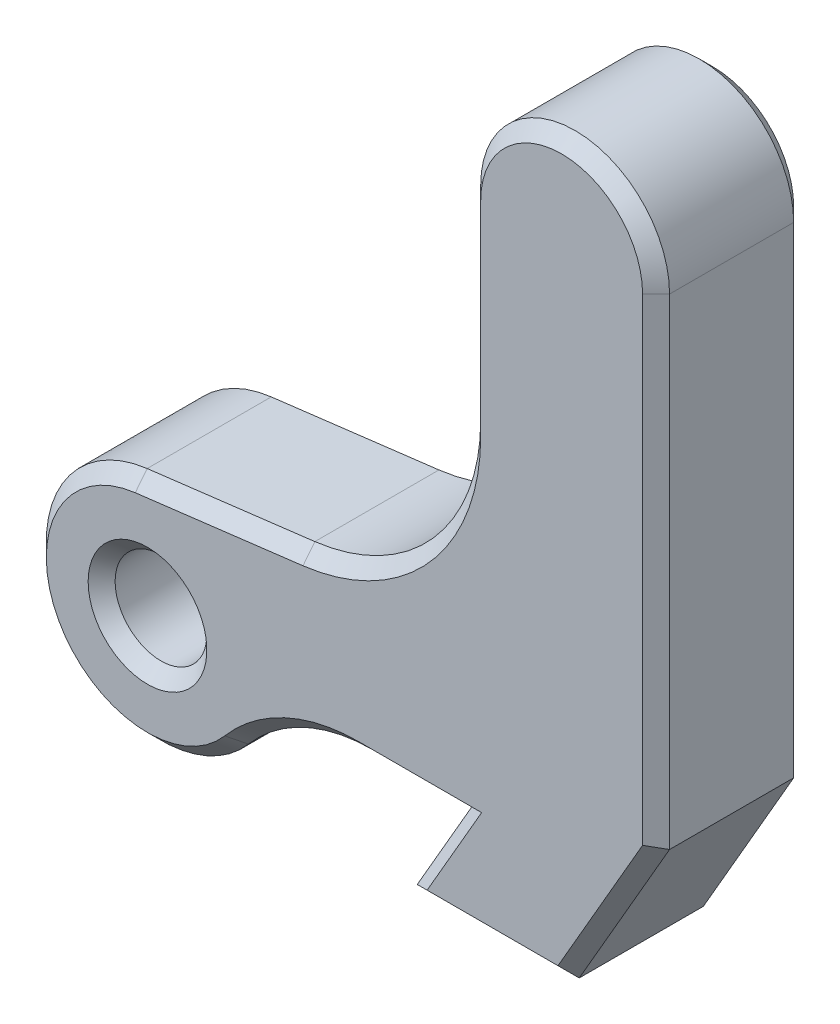
ISO-10303-21;
HEADER;
FILE_DESCRIPTION(('STEP AP214'),'2;1');
FILE_NAME('part.step','',(''),(''),'','','');
FILE_SCHEMA(('AUTOMOTIVE_DESIGN { 1 0 10303 214 1 1 1 1 }'));
ENDSEC;
DATA;
#1=APPLICATION_CONTEXT('core data for automotive mechanical design processes');
#2=APPLICATION_PROTOCOL_DEFINITION('international standard','automotive_design',2000,#1);
#3=PRODUCT_CONTEXT('',#1,'mechanical');
#4=PRODUCT('Part','Part','',(#3));
#5=PRODUCT_RELATED_PRODUCT_CATEGORY('part','',(#4));
#6=PRODUCT_DEFINITION_FORMATION('','',#4);
#7=PRODUCT_DEFINITION_CONTEXT('part definition',#1,'design');
#8=PRODUCT_DEFINITION('design','',#6,#7);
#9=PRODUCT_DEFINITION_SHAPE('','',#8);
#10=(LENGTH_UNIT() NAMED_UNIT(*) SI_UNIT(.MILLI.,.METRE.));
#11=(NAMED_UNIT(*) PLANE_ANGLE_UNIT() SI_UNIT($,.RADIAN.));
#12=(NAMED_UNIT(*) SI_UNIT($,.STERADIAN.) SOLID_ANGLE_UNIT());
#13=UNCERTAINTY_MEASURE_WITH_UNIT(LENGTH_MEASURE(1.E-05),#10,'distance_accuracy_value','');
#14=(GEOMETRIC_REPRESENTATION_CONTEXT(3) GLOBAL_UNCERTAINTY_ASSIGNED_CONTEXT((#13)) GLOBAL_UNIT_ASSIGNED_CONTEXT((#10,
#11,#12)) REPRESENTATION_CONTEXT('',''));
#15=CARTESIAN_POINT('',(0.,0.,0.));
#16=DIRECTION('',(0.,0.,1.));
#17=DIRECTION('',(1.,0.,0.));
#18=AXIS2_PLACEMENT_3D('',#15,#16,#17);
#19=CARTESIAN_POINT('',(19.5977967476419,23.7480755988893,5.6));
#20=DIRECTION('',(0.,0.,-1.));
#21=DIRECTION('',(-1.,0.,0.));
#22=AXIS2_PLACEMENT_3D('',#19,#20,#21);
#23=PLANE('',#22);
#24=CARTESIAN_POINT('',(4.24779677552308,4.24740051239632,5.6));
#25=DIRECTION('',(0.,0.,-1.));
#26=DIRECTION('',(-1.,0.,0.));
#27=AXIS2_PLACEMENT_3D('',#24,#25,#26);
#28=CIRCLE('',#27,2.19999999999999);
#29=CARTESIAN_POINT('',(2.04779677552308,4.24740051239632,5.6));
#30=VERTEX_POINT('',#29);
#31=EDGE_CURVE('E11',#30,#30,#28,.T.);
#32=ORIENTED_EDGE('',*,*,#31,.T.);
#33=EDGE_LOOP('',(#32));
#34=FACE_BOUND('',#33,.T.);
#35=DIRECTION('',(0.500000000000001,0.866025403784438,0.));
#36=VECTOR('',#35,1.);
#37=CARTESIAN_POINT('',(29.5097465579445,18.025408707717,5.6));
#38=LINE('',#37,#36);
#39=CARTESIAN_POINT('',(19.4616011301781,0.621510304984686,5.6));
#40=VERTEX_POINT('',#39);
#41=CARTESIAN_POINT('',(22.5977967755231,6.05356050519845,5.6));
#42=VERTEX_POINT('',#41);
#43=EDGE_CURVE('E50',#40,#42,#38,.T.);
#44=ORIENTED_EDGE('',*,*,#43,.T.);
#45=DIRECTION('',(0.,1.,0.));
#46=VECTOR('',#45,1.);
#47=CARTESIAN_POINT('',(22.5977967755231,23.7480755988893,5.6));
#48=LINE('',#47,#46);
#49=CARTESIAN_POINT('',(22.5977967755231,23.7480755988893,5.6));
#50=VERTEX_POINT('',#49);
#51=EDGE_CURVE('E42',#42,#50,#48,.T.);
#52=ORIENTED_EDGE('',*,*,#51,.T.);
#53=CARTESIAN_POINT('',(19.5977967476419,23.7480755988893,5.6));
#54=DIRECTION('',(0.,0.,-1.));
#55=DIRECTION('',(-1.,0.,0.));
#56=AXIS2_PLACEMENT_3D('',#53,#54,#55);
#57=CIRCLE('',#56,3.00000002788114);
#58=CARTESIAN_POINT('',(16.5977967197608,23.7480755988893,5.6));
#59=VERTEX_POINT('',#58);
#60=EDGE_CURVE('E269',#50,#59,#57,.F.);
#61=ORIENTED_EDGE('',*,*,#60,.T.);
#62=DIRECTION('',(0.,-1.,0.));
#63=VECTOR('',#62,1.);
#64=CARTESIAN_POINT('',(16.5977967197608,23.7480755988893,5.6));
#65=LINE('',#64,#63);
#66=CARTESIAN_POINT('',(16.5977967197608,16.1773871829658,5.6));
#67=VERTEX_POINT('',#66);
#68=EDGE_CURVE('E271',#59,#67,#65,.T.);
#69=ORIENTED_EDGE('',*,*,#68,.T.);
#70=CARTESIAN_POINT('',(9.0977967197608,16.1773871829658,5.6));
#71=DIRECTION('',(0.,0.,-1.));
#72=DIRECTION('',(-1.,0.,0.));
#73=AXIS2_PLACEMENT_3D('',#70,#71,#72);
#74=CIRCLE('',#73,7.5);
#75=CARTESIAN_POINT('',(10.0118164490113,8.73329100313708,5.6));
#76=VERTEX_POINT('',#75);
#77=EDGE_CURVE('E273',#67,#76,#74,.T.);
#78=ORIENTED_EDGE('',*,*,#77,.T.);
#79=DIRECTION('',(-0.992546157310499,-0.121869297233397,0.));
#80=VECTOR('',#79,1.);
#81=CARTESIAN_POINT('',(21.2716264621641,10.1158212997661,5.6));
#82=LINE('',#81,#80);
#83=CARTESIAN_POINT('',(3.79567087701856,7.97004459209662,5.6));
#84=VERTEX_POINT('',#83);
#85=EDGE_CURVE('E275',#76,#84,#82,.T.);
#86=ORIENTED_EDGE('',*,*,#85,.T.);
#87=CARTESIAN_POINT('',(4.24779677552308,4.24740051239632,5.6));
#88=DIRECTION('',(0.,0.,-1.));
#89=DIRECTION('',(-1.,0.,0.));
#90=AXIS2_PLACEMENT_3D('',#87,#88,#89);
#91=CIRCLE('',#90,3.75);
#92=CARTESIAN_POINT('',(7.10895200722131,1.82329433895304,5.6));
#93=VERTEX_POINT('',#92);
#94=EDGE_CURVE('E277',#84,#93,#91,.F.);
#95=ORIENTED_EDGE('',*,*,#94,.T.);
#96=CARTESIAN_POINT('',(12.0682877421649,-2.37848969501531,5.6));
#97=DIRECTION('',(0.,0.,-1.));
#98=DIRECTION('',(-1.,0.,0.));
#99=AXIS2_PLACEMENT_3D('',#96,#97,#98);
#100=CIRCLE('',#99,6.5);
#101=CARTESIAN_POINT('',(12.0682877421649,4.12151030498469,5.6));
#102=VERTEX_POINT('',#101);
#103=EDGE_CURVE('E279',#93,#102,#100,.T.);
#104=ORIENTED_EDGE('',*,*,#103,.T.);
#105=DIRECTION('',(1.,0.,0.));
#106=VECTOR('',#105,1.);
#107=CARTESIAN_POINT('',(19.5977967476419,4.12151030498469,5.6));
#108=LINE('',#107,#106);
#109=CARTESIAN_POINT('',(16.6325848111489,4.12151030498469,5.6));
#110=VERTEX_POINT('',#109);
#111=EDGE_CURVE('E281',#102,#110,#108,.T.);
#112=ORIENTED_EDGE('',*,*,#111,.T.);
#113=DIRECTION('',(-0.500000000000001,-0.866025403784438,0.));
#114=VECTOR('',#113,1.);
#115=CARTESIAN_POINT('',(25.8724398620499,20.125408707717,5.6));
#116=LINE('',#115,#114);
#117=CARTESIAN_POINT('',(14.6118588689852,0.621510304984685,5.6));
#118=VERTEX_POINT('',#117);
#119=EDGE_CURVE('E283',#110,#118,#116,.T.);
#120=ORIENTED_EDGE('',*,*,#119,.T.);
#121=DIRECTION('',(1.,0.,0.));
#122=VECTOR('',#121,1.);
#123=CARTESIAN_POINT('',(19.5977967476419,0.621510304984686,5.6));
#124=LINE('',#123,#122);
#125=EDGE_CURVE('E55',#118,#40,#124,.T.);
#126=ORIENTED_EDGE('',*,*,#125,.T.);
#127=EDGE_LOOP('',(#44,#52,#61,#69,#78,#86,#95,#104,#112,#120,#126));
#128=FACE_BOUND('',#127,.T.);
#129=ADVANCED_FACE('F33',(#34,#128),#23,.F.);
#130=CARTESIAN_POINT('',(19.5977967476419,23.7480755988893,0.));
#131=DIRECTION('',(0.,0.,-1.));
#132=DIRECTION('',(-1.,0.,0.));
#133=AXIS2_PLACEMENT_3D('',#130,#131,#132);
#134=PLANE('',#133);
#135=CARTESIAN_POINT('',(4.24779677552308,4.24740051239632,0.));
#136=DIRECTION('',(0.,0.,-1.));
#137=DIRECTION('',(-1.,0.,0.));
#138=AXIS2_PLACEMENT_3D('',#135,#136,#137);
#139=CIRCLE('',#138,2.2);
#140=CARTESIAN_POINT('',(2.04779677552308,4.24740051239632,0.));
#141=VERTEX_POINT('',#140);
#142=EDGE_CURVE('E211',#141,#141,#139,.F.);
#143=ORIENTED_EDGE('',*,*,#142,.T.);
#144=EDGE_LOOP('',(#143));
#145=FACE_BOUND('',#144,.T.);
#146=CARTESIAN_POINT('',(9.0977967197608,16.1773871829658,0.));
#147=DIRECTION('',(0.,0.,-1.));
#148=DIRECTION('',(-1.,0.,0.));
#149=AXIS2_PLACEMENT_3D('',#146,#147,#148);
#150=CIRCLE('',#149,7.5);
#151=CARTESIAN_POINT('',(10.0118164490113,8.73329100313708,0.));
#152=VERTEX_POINT('',#151);
#153=CARTESIAN_POINT('',(16.5977967197608,16.1773871829658,0.));
#154=VERTEX_POINT('',#153);
#155=EDGE_CURVE('E210',#152,#154,#150,.F.);
#156=ORIENTED_EDGE('',*,*,#155,.T.);
#157=DIRECTION('',(0.,1.,0.));
#158=VECTOR('',#157,1.);
#159=CARTESIAN_POINT('',(16.5977967197608,23.7480755988893,0.));
#160=LINE('',#159,#158);
#161=CARTESIAN_POINT('',(16.5977967197608,23.7480755988893,0.));
#162=VERTEX_POINT('',#161);
#163=EDGE_CURVE('E189',#154,#162,#160,.T.);
#164=ORIENTED_EDGE('',*,*,#163,.T.);
#165=CARTESIAN_POINT('',(19.5977967476419,23.7480755988893,0.));
#166=DIRECTION('',(0.,0.,-1.));
#167=DIRECTION('',(-1.,0.,0.));
#168=AXIS2_PLACEMENT_3D('',#165,#166,#167);
#169=CIRCLE('',#168,3.00000002788114);
#170=CARTESIAN_POINT('',(22.5977967755231,23.7480755988893,0.));
#171=VERTEX_POINT('',#170);
#172=EDGE_CURVE('E199',#162,#171,#169,.T.);
#173=ORIENTED_EDGE('',*,*,#172,.T.);
#174=DIRECTION('',(0.,-1.,0.));
#175=VECTOR('',#174,1.);
#176=CARTESIAN_POINT('',(22.5977967755231,5.91958590898287,0.));
#177=LINE('',#176,#175);
#178=CARTESIAN_POINT('',(22.5977967755231,6.05356050519843,0.));
#179=VERTEX_POINT('',#178);
#180=EDGE_CURVE('E205',#171,#179,#177,.T.);
#181=ORIENTED_EDGE('',*,*,#180,.T.);
#182=DIRECTION('',(-0.500000000000001,-0.866025403784438,0.));
#183=VECTOR('',#182,1.);
#184=CARTESIAN_POINT('',(19.3172635628807,0.371510304984689,0.));
#185=LINE('',#184,#183);
#186=CARTESIAN_POINT('',(19.4616011301781,0.621510304984692,0.));
#187=VERTEX_POINT('',#186);
#188=EDGE_CURVE('E385',#179,#187,#185,.T.);
#189=ORIENTED_EDGE('',*,*,#188,.T.);
#190=DIRECTION('',(-1.,0.,0.));
#191=VECTOR('',#190,1.);
#192=CARTESIAN_POINT('',(13.7458334652008,0.621510304984693,0.));
#193=LINE('',#192,#191);
#194=CARTESIAN_POINT('',(14.6118588689853,0.621510304984693,0.));
#195=VERTEX_POINT('',#194);
#196=EDGE_CURVE('E387',#187,#195,#193,.T.);
#197=ORIENTED_EDGE('',*,*,#196,.T.);
#198=DIRECTION('',(0.500000000000001,0.866025403784438,0.));
#199=VECTOR('',#198,1.);
#200=CARTESIAN_POINT('',(16.1995721092567,3.37151030498469,0.));
#201=LINE('',#200,#199);
#202=CARTESIAN_POINT('',(16.6325848111489,4.12151030498469,0.));
#203=VERTEX_POINT('',#202);
#204=EDGE_CURVE('E389',#195,#203,#201,.T.);
#205=ORIENTED_EDGE('',*,*,#204,.T.);
#206=DIRECTION('',(-1.,0.,0.));
#207=VECTOR('',#206,1.);
#208=CARTESIAN_POINT('',(12.0682877421649,4.12151030498469,0.));
#209=LINE('',#208,#207);
#210=CARTESIAN_POINT('',(12.0682877421649,4.12151030498469,0.));
#211=VERTEX_POINT('',#210);
#212=EDGE_CURVE('E391',#203,#211,#209,.T.);
#213=ORIENTED_EDGE('',*,*,#212,.T.);
#214=CARTESIAN_POINT('',(12.0682877421649,-2.37848969501531,0.));
#215=DIRECTION('',(0.,0.,-1.));
#216=DIRECTION('',(-1.,0.,0.));
#217=AXIS2_PLACEMENT_3D('',#214,#215,#216);
#218=CIRCLE('',#217,6.5);
#219=CARTESIAN_POINT('',(7.10895200722131,1.82329433895304,0.));
#220=VERTEX_POINT('',#219);
#221=EDGE_CURVE('E393',#211,#220,#218,.F.);
#222=ORIENTED_EDGE('',*,*,#221,.T.);
#223=CARTESIAN_POINT('',(4.24779677552308,4.24740051239632,0.));
#224=DIRECTION('',(0.,0.,-1.));
#225=DIRECTION('',(-1.,0.,0.));
#226=AXIS2_PLACEMENT_3D('',#223,#224,#225);
#227=CIRCLE('',#226,3.75);
#228=CARTESIAN_POINT('',(3.79632207178138,7.97012405731358,0.));
#229=VERTEX_POINT('',#228);
#230=EDGE_CURVE('E395',#220,#229,#227,.T.);
#231=ORIENTED_EDGE('',*,*,#230,.T.);
#232=DIRECTION('',(0.992546157310499,0.121869297233397,0.));
#233=VECTOR('',#232,1.);
#234=CARTESIAN_POINT('',(10.0118164490113,8.73329100313708,0.));
#235=LINE('',#234,#233);
#236=EDGE_CURVE('E216',#229,#152,#235,.T.);
#237=ORIENTED_EDGE('',*,*,#236,.T.);
#238=EDGE_LOOP('',(#156,#164,#173,#181,#189,#197,#205,#213,#222,#231,#237));
#239=FACE_BOUND('',#238,.T.);
#240=ADVANCED_FACE('F208',(#145,#239),#134,.T.);
#241=CARTESIAN_POINT('',(19.5977967476419,23.7480755988893,5.6));
#242=DIRECTION('',(0.,0.,-1.));
#243=DIRECTION('',(-1.,0.,0.));
#244=AXIS2_PLACEMENT_3D('',#241,#242,#243);
#245=CYLINDRICAL_SURFACE('',#244,3.50000002788114);
#246=DIRECTION('',(0.,0.,-1.));
#247=VECTOR('',#246,1.);
#248=CARTESIAN_POINT('',(23.0977967755231,23.7480755988893,5.6));
#249=LINE('',#248,#247);
#250=CARTESIAN_POINT('',(23.0977967755231,23.7480755988893,5.1));
#251=VERTEX_POINT('',#250);
#252=CARTESIAN_POINT('',(23.0977967755231,23.7480755988893,0.500000000000004));
#253=VERTEX_POINT('',#252);
#254=EDGE_CURVE('E313',#251,#253,#249,.T.);
#255=ORIENTED_EDGE('',*,*,#254,.T.);
#256=CARTESIAN_POINT('',(19.5977967476419,23.7480755988893,0.500000000000004));
#257=DIRECTION('',(0.,0.,-1.));
#258=DIRECTION('',(-1.,0.,0.));
#259=AXIS2_PLACEMENT_3D('',#256,#257,#258);
#260=CIRCLE('',#259,3.50000002788114);
#261=CARTESIAN_POINT('',(16.0977967197608,23.7480755988893,0.500000000000004));
#262=VERTEX_POINT('',#261);
#263=EDGE_CURVE('E267',#253,#262,#260,.F.);
#264=ORIENTED_EDGE('',*,*,#263,.T.);
#265=DIRECTION('',(0.,0.,-1.));
#266=VECTOR('',#265,1.);
#267=CARTESIAN_POINT('',(16.0977967197608,23.7480755988893,5.6));
#268=LINE('',#267,#266);
#269=CARTESIAN_POINT('',(16.0977967197608,23.7480755988893,5.1));
#270=VERTEX_POINT('',#269);
#271=EDGE_CURVE('E206',#270,#262,#268,.T.);
#272=ORIENTED_EDGE('',*,*,#271,.F.);
#273=CARTESIAN_POINT('',(19.5977967476419,23.7480755988893,5.1));
#274=DIRECTION('',(0.,0.,-1.));
#275=DIRECTION('',(-1.,0.,0.));
#276=AXIS2_PLACEMENT_3D('',#273,#274,#275);
#277=CIRCLE('',#276,3.50000002788114);
#278=EDGE_CURVE('E265',#270,#251,#277,.T.);
#279=ORIENTED_EDGE('',*,*,#278,.T.);
#280=EDGE_LOOP('',(#255,#264,#272,#279));
#281=FACE_BOUND('',#280,.T.);
#282=ADVANCED_FACE('F434',(#281),#245,.T.);
#283=CARTESIAN_POINT('',(16.0977967197608,23.7480755988893,5.6));
#284=DIRECTION('',(1.,0.,0.));
#285=DIRECTION('',(0.,1.,0.));
#286=AXIS2_PLACEMENT_3D('',#283,#284,#285);
#287=PLANE('',#286);
#288=ORIENTED_EDGE('',*,*,#271,.T.);
#289=DIRECTION('',(0.,-1.,0.));
#290=VECTOR('',#289,1.);
#291=CARTESIAN_POINT('',(16.0977967197608,16.1773871829658,0.500000000000004));
#292=LINE('',#291,#290);
#293=CARTESIAN_POINT('',(16.0977967197608,16.1773871829658,0.500000000000004));
#294=VERTEX_POINT('',#293);
#295=EDGE_CURVE('E192',#262,#294,#292,.T.);
#296=ORIENTED_EDGE('',*,*,#295,.T.);
#297=DIRECTION('',(0.,0.,-1.));
#298=VECTOR('',#297,1.);
#299=CARTESIAN_POINT('',(16.0977967197608,16.1773871829658,5.6));
#300=LINE('',#299,#298);
#301=CARTESIAN_POINT('',(16.0977967197608,16.1773871829658,5.1));
#302=VERTEX_POINT('',#301);
#303=EDGE_CURVE('E371',#302,#294,#300,.T.);
#304=ORIENTED_EDGE('',*,*,#303,.F.);
#305=DIRECTION('',(0.,1.,0.));
#306=VECTOR('',#305,1.);
#307=CARTESIAN_POINT('',(16.0977967197608,23.7480755988893,5.1));
#308=LINE('',#307,#306);
#309=EDGE_CURVE('E225',#302,#270,#308,.T.);
#310=ORIENTED_EDGE('',*,*,#309,.T.);
#311=EDGE_LOOP('',(#288,#296,#304,#310));
#312=FACE_BOUND('',#311,.T.);
#313=ADVANCED_FACE('F376',(#312),#287,.F.);
#314=CARTESIAN_POINT('',(9.0977967197608,16.1773871829658,5.6));
#315=DIRECTION('',(0.,0.,-1.));
#316=DIRECTION('',(-1.,0.,0.));
#317=AXIS2_PLACEMENT_3D('',#314,#315,#316);
#318=CYLINDRICAL_SURFACE('',#317,7.);
#319=ORIENTED_EDGE('',*,*,#303,.T.);
#320=CARTESIAN_POINT('',(9.0977967197608,16.1773871829658,0.500000000000004));
#321=DIRECTION('',(0.,0.,-1.));
#322=DIRECTION('',(-1.,0.,0.));
#323=AXIS2_PLACEMENT_3D('',#320,#321,#322);
#324=CIRCLE('',#323,7.);
#325=CARTESIAN_POINT('',(9.95088180039458,9.22956408179233,0.500000000000004));
#326=VERTEX_POINT('',#325);
#327=EDGE_CURVE('E230',#294,#326,#324,.T.);
#328=ORIENTED_EDGE('',*,*,#327,.T.);
#329=DIRECTION('',(0.,0.,-1.));
#330=VECTOR('',#329,1.);
#331=CARTESIAN_POINT('',(9.95088180039458,9.22956408179233,5.6));
#332=LINE('',#331,#330);
#333=CARTESIAN_POINT('',(9.95088180039458,9.22956408179233,5.1));
#334=VERTEX_POINT('',#333);
#335=EDGE_CURVE('E373',#334,#326,#332,.T.);
#336=ORIENTED_EDGE('',*,*,#335,.F.);
#337=CARTESIAN_POINT('',(9.0977967197608,16.1773871829658,5.1));
#338=DIRECTION('',(0.,0.,-1.));
#339=DIRECTION('',(-1.,0.,0.));
#340=AXIS2_PLACEMENT_3D('',#337,#338,#339);
#341=CIRCLE('',#340,7.);
#342=EDGE_CURVE('E228',#334,#302,#341,.F.);
#343=ORIENTED_EDGE('',*,*,#342,.T.);
#344=EDGE_LOOP('',(#319,#328,#336,#343));
#345=FACE_BOUND('',#344,.T.);
#346=ADVANCED_FACE('F370',(#345),#318,.F.);
#347=CARTESIAN_POINT('',(3.73538736444252,8.46639762017396,5.6));
#348=DIRECTION('',(0.121869297233397,-0.992546157310499,0.));
#349=DIRECTION('',(0.992546157310499,0.121869297233397,0.));
#350=AXIS2_PLACEMENT_3D('',#347,#348,#349);
#351=PLANE('',#350);
#352=ORIENTED_EDGE('',*,*,#335,.T.);
#353=DIRECTION('',(-0.992546157310499,-0.121869297233397,0.));
#354=VECTOR('',#353,1.);
#355=CARTESIAN_POINT('',(3.73538736444252,8.46639762017396,0.500000000000004));
#356=LINE('',#355,#354);
#357=CARTESIAN_POINT('',(3.73538736444252,8.46639762017396,0.500000000000004));
#358=VERTEX_POINT('',#357);
#359=EDGE_CURVE('E234',#326,#358,#356,.T.);
#360=ORIENTED_EDGE('',*,*,#359,.T.);
#361=DIRECTION('',(0.,0.,-1.));
#362=VECTOR('',#361,1.);
#363=CARTESIAN_POINT('',(3.73538736444252,8.46639762017396,5.6));
#364=LINE('',#363,#362);
#365=CARTESIAN_POINT('',(3.73538736444252,8.46639762017396,5.1));
#366=VERTEX_POINT('',#365);
#367=EDGE_CURVE('E380',#366,#358,#364,.T.);
#368=ORIENTED_EDGE('',*,*,#367,.F.);
#369=DIRECTION('',(0.992546157310499,0.121869297233397,0.));
#370=VECTOR('',#369,1.);
#371=CARTESIAN_POINT('',(3.73538736444252,8.46639762017396,5.1));
#372=LINE('',#371,#370);
#373=EDGE_CURVE('E232',#366,#334,#372,.T.);
#374=ORIENTED_EDGE('',*,*,#373,.T.);
#375=EDGE_LOOP('',(#352,#360,#368,#374));
#376=FACE_BOUND('',#375,.T.);
#377=ADVANCED_FACE('F407',(#376),#351,.F.);
#378=CARTESIAN_POINT('',(4.24779677552308,4.24740051239632,5.6));
#379=DIRECTION('',(0.,0.,-1.));
#380=DIRECTION('',(-1.,0.,0.));
#381=AXIS2_PLACEMENT_3D('',#378,#379,#380);
#382=CYLINDRICAL_SURFACE('',#381,4.25);
#383=ORIENTED_EDGE('',*,*,#367,.T.);
#384=CARTESIAN_POINT('',(4.24779677552308,4.24740051239632,0.500000000000004));
#385=DIRECTION('',(0.,0.,-1.));
#386=DIRECTION('',(-1.,0.,0.));
#387=AXIS2_PLACEMENT_3D('',#384,#385,#386);
#388=CIRCLE('',#387,4.25);
#389=CARTESIAN_POINT('',(7.49043937144774,1.50008018249394,0.500000000000004));
#390=VERTEX_POINT('',#389);
#391=EDGE_CURVE('E238',#358,#390,#388,.F.);
#392=ORIENTED_EDGE('',*,*,#391,.T.);
#393=DIRECTION('',(0.,0.,-1.));
#394=VECTOR('',#393,1.);
#395=CARTESIAN_POINT('',(7.49043937144774,1.50008018249394,5.6));
#396=LINE('',#395,#394);
#397=CARTESIAN_POINT('',(7.49043937144774,1.50008018249394,5.1));
#398=VERTEX_POINT('',#397);
#399=EDGE_CURVE('E412',#398,#390,#396,.T.);
#400=ORIENTED_EDGE('',*,*,#399,.F.);
#401=CARTESIAN_POINT('',(4.24779677552308,4.24740051239632,5.1));
#402=DIRECTION('',(0.,0.,-1.));
#403=DIRECTION('',(-1.,0.,0.));
#404=AXIS2_PLACEMENT_3D('',#401,#402,#403);
#405=CIRCLE('',#404,4.25);
#406=EDGE_CURVE('E236',#398,#366,#405,.T.);
#407=ORIENTED_EDGE('',*,*,#406,.T.);
#408=EDGE_LOOP('',(#383,#392,#400,#407));
#409=FACE_BOUND('',#408,.T.);
#410=ADVANCED_FACE('F470',(#409),#382,.T.);
#411=CARTESIAN_POINT('',(12.0682877421649,-2.37848969501531,5.6));
#412=DIRECTION('',(0.,0.,-1.));
#413=DIRECTION('',(-1.,0.,0.));
#414=AXIS2_PLACEMENT_3D('',#411,#412,#413);
#415=CYLINDRICAL_SURFACE('',#414,6.);
#416=ORIENTED_EDGE('',*,*,#399,.T.);
#417=CARTESIAN_POINT('',(12.0682877421649,-2.37848969501531,0.500000000000004));
#418=DIRECTION('',(0.,0.,-1.));
#419=DIRECTION('',(-1.,0.,0.));
#420=AXIS2_PLACEMENT_3D('',#417,#418,#419);
#421=CIRCLE('',#420,6.);
#422=CARTESIAN_POINT('',(12.0682877421649,3.62151030498469,0.500000000000004));
#423=VERTEX_POINT('',#422);
#424=EDGE_CURVE('E242',#390,#423,#421,.T.);
#425=ORIENTED_EDGE('',*,*,#424,.T.);
#426=DIRECTION('',(0.,0.,-1.));
#427=VECTOR('',#426,1.);
#428=CARTESIAN_POINT('',(12.0682877421649,3.62151030498469,5.6));
#429=LINE('',#428,#427);
#430=CARTESIAN_POINT('',(12.0682877421649,3.62151030498469,5.1));
#431=VERTEX_POINT('',#430);
#432=EDGE_CURVE('E414',#431,#423,#429,.T.);
#433=ORIENTED_EDGE('',*,*,#432,.F.);
#434=CARTESIAN_POINT('',(12.0682877421649,-2.37848969501531,5.1));
#435=DIRECTION('',(0.,0.,-1.));
#436=DIRECTION('',(-1.,0.,0.));
#437=AXIS2_PLACEMENT_3D('',#434,#435,#436);
#438=CIRCLE('',#437,6.);
#439=EDGE_CURVE('E240',#431,#398,#438,.F.);
#440=ORIENTED_EDGE('',*,*,#439,.T.);
#441=EDGE_LOOP('',(#416,#425,#433,#440));
#442=FACE_BOUND('',#441,.T.);
#443=ADVANCED_FACE('F472',(#442),#415,.F.);
#444=CARTESIAN_POINT('',(12.0682877421649,3.62151030498469,5.6));
#445=DIRECTION('',(0.,1.,0.));
#446=DIRECTION('',(0.,0.,1.));
#447=AXIS2_PLACEMENT_3D('',#444,#445,#446);
#448=PLANE('',#447);
#449=ORIENTED_EDGE('',*,*,#432,.T.);
#450=DIRECTION('',(1.,0.,0.));
#451=VECTOR('',#450,1.);
#452=CARTESIAN_POINT('',(15.7665594073645,3.62151030498469,0.500000000000004));
#453=LINE('',#452,#451);
#454=CARTESIAN_POINT('',(15.7665594073645,3.62151030498469,0.500000000000004));
#455=VERTEX_POINT('',#454);
#456=EDGE_CURVE('E246',#423,#455,#453,.T.);
#457=ORIENTED_EDGE('',*,*,#456,.T.);
#458=DIRECTION('',(0.,0.,-1.));
#459=VECTOR('',#458,1.);
#460=CARTESIAN_POINT('',(15.7665594073645,3.62151030498469,5.6));
#461=LINE('',#460,#459);
#462=CARTESIAN_POINT('',(15.7665594073645,3.62151030498469,5.1));
#463=VERTEX_POINT('',#462);
#464=EDGE_CURVE('E419',#463,#455,#461,.T.);
#465=ORIENTED_EDGE('',*,*,#464,.F.);
#466=DIRECTION('',(-1.,0.,0.));
#467=VECTOR('',#466,1.);
#468=CARTESIAN_POINT('',(12.0682877421649,3.62151030498469,5.1));
#469=LINE('',#468,#467);
#470=EDGE_CURVE('E244',#463,#431,#469,.T.);
#471=ORIENTED_EDGE('',*,*,#470,.T.);
#472=EDGE_LOOP('',(#449,#457,#465,#471));
#473=FACE_BOUND('',#472,.T.);
#474=ADVANCED_FACE('F475',(#473),#448,.F.);
#475=CARTESIAN_POINT('',(15.7665594073645,3.62151030498469,5.6));
#476=DIRECTION('',(0.866025403784438,-0.500000000000001,0.));
#477=DIRECTION('',(0.500000000000001,0.866025403784438,0.));
#478=AXIS2_PLACEMENT_3D('',#475,#476,#477);
#479=PLANE('',#478);
#480=ORIENTED_EDGE('',*,*,#464,.T.);
#481=DIRECTION('',(-0.500000000000001,-0.866025403784438,0.));
#482=VECTOR('',#481,1.);
#483=CARTESIAN_POINT('',(13.7458334652008,0.121510304984688,0.500000000000004));
#484=LINE('',#483,#482);
#485=CARTESIAN_POINT('',(13.7458334652008,0.121510304984688,0.500000000000004));
#486=VERTEX_POINT('',#485);
#487=EDGE_CURVE('E250',#455,#486,#484,.T.);
#488=ORIENTED_EDGE('',*,*,#487,.T.);
#489=DIRECTION('',(0.,0.,-1.));
#490=VECTOR('',#489,1.);
#491=CARTESIAN_POINT('',(13.7458334652008,0.121510304984688,5.6));
#492=LINE('',#491,#490);
#493=CARTESIAN_POINT('',(13.7458334652008,0.121510304984688,5.1));
#494=VERTEX_POINT('',#493);
#495=EDGE_CURVE('E422',#494,#486,#492,.T.);
#496=ORIENTED_EDGE('',*,*,#495,.F.);
#497=DIRECTION('',(0.500000000000001,0.866025403784438,0.));
#498=VECTOR('',#497,1.);
#499=CARTESIAN_POINT('',(15.7665594073645,3.62151030498469,5.1));
#500=LINE('',#499,#498);
#501=EDGE_CURVE('E248',#494,#463,#500,.T.);
#502=ORIENTED_EDGE('',*,*,#501,.T.);
#503=EDGE_LOOP('',(#480,#488,#496,#502));
#504=FACE_BOUND('',#503,.T.);
#505=ADVANCED_FACE('F529',(#504),#479,.F.);
#506=CARTESIAN_POINT('',(13.7458334652008,0.121510304984688,5.6));
#507=DIRECTION('',(0.,1.,0.));
#508=DIRECTION('',(0.,0.,1.));
#509=AXIS2_PLACEMENT_3D('',#506,#507,#508);
#510=PLANE('',#509);
#511=ORIENTED_EDGE('',*,*,#495,.T.);
#512=DIRECTION('',(1.,0.,0.));
#513=VECTOR('',#512,1.);
#514=CARTESIAN_POINT('',(19.7502762647729,0.121510304984688,0.500000000000004));
#515=LINE('',#514,#513);
#516=CARTESIAN_POINT('',(19.7502762647729,0.121510304984688,0.500000000000005));
#517=VERTEX_POINT('',#516);
#518=EDGE_CURVE('E254',#486,#517,#515,.T.);
#519=ORIENTED_EDGE('',*,*,#518,.T.);
#520=DIRECTION('',(0.,0.,-1.));
#521=VECTOR('',#520,1.);
#522=CARTESIAN_POINT('',(19.7502762647729,0.121510304984688,5.6));
#523=LINE('',#522,#521);
#524=CARTESIAN_POINT('',(19.7502762647729,0.121510304984688,5.1));
#525=VERTEX_POINT('',#524);
#526=EDGE_CURVE('E425',#525,#517,#523,.T.);
#527=ORIENTED_EDGE('',*,*,#526,.F.);
#528=DIRECTION('',(-1.,0.,0.));
#529=VECTOR('',#528,1.);
#530=CARTESIAN_POINT('',(13.7458334652008,0.121510304984688,5.1));
#531=LINE('',#530,#529);
#532=EDGE_CURVE('E252',#525,#494,#531,.T.);
#533=ORIENTED_EDGE('',*,*,#532,.T.);
#534=EDGE_LOOP('',(#511,#519,#527,#533));
#535=FACE_BOUND('',#534,.T.);
#536=ADVANCED_FACE('F525',(#535),#510,.F.);
#537=CARTESIAN_POINT('',(19.7502762647729,0.121510304984688,5.6));
#538=DIRECTION('',(-0.866025403784438,0.500000000000001,0.));
#539=DIRECTION('',(-0.500000000000001,-0.866025403784438,0.));
#540=AXIS2_PLACEMENT_3D('',#537,#538,#539);
#541=PLANE('',#540);
#542=ORIENTED_EDGE('',*,*,#526,.T.);
#543=DIRECTION('',(0.500000000000001,0.866025403784438,0.));
#544=VECTOR('',#543,1.);
#545=CARTESIAN_POINT('',(23.0977967755231,5.91958590898287,0.500000000000004));
#546=LINE('',#545,#544);
#547=CARTESIAN_POINT('',(23.0977967755231,5.91958590898287,0.500000000000004));
#548=VERTEX_POINT('',#547);
#549=EDGE_CURVE('E258',#517,#548,#546,.T.);
#550=ORIENTED_EDGE('',*,*,#549,.T.);
#551=DIRECTION('',(0.,0.,-1.));
#552=VECTOR('',#551,1.);
#553=CARTESIAN_POINT('',(23.0977967755231,5.91958590898287,5.6));
#554=LINE('',#553,#552);
#555=CARTESIAN_POINT('',(23.0977967755231,5.91958590898287,5.1));
#556=VERTEX_POINT('',#555);
#557=EDGE_CURVE('E428',#556,#548,#554,.T.);
#558=ORIENTED_EDGE('',*,*,#557,.F.);
#559=DIRECTION('',(-0.500000000000001,-0.866025403784438,0.));
#560=VECTOR('',#559,1.);
#561=CARTESIAN_POINT('',(19.7502762647729,0.121510304984688,5.1));
#562=LINE('',#561,#560);
#563=EDGE_CURVE('E256',#556,#525,#562,.T.);
#564=ORIENTED_EDGE('',*,*,#563,.T.);
#565=EDGE_LOOP('',(#542,#550,#558,#564));
#566=FACE_BOUND('',#565,.T.);
#567=ADVANCED_FACE('F522',(#566),#541,.F.);
#568=CARTESIAN_POINT('',(23.0977967755231,5.91958590898287,5.6));
#569=DIRECTION('',(-1.,0.,0.));
#570=DIRECTION('',(0.,-1.,0.));
#571=AXIS2_PLACEMENT_3D('',#568,#569,#570);
#572=PLANE('',#571);
#573=ORIENTED_EDGE('',*,*,#557,.T.);
#574=DIRECTION('',(0.,1.,0.));
#575=VECTOR('',#574,1.);
#576=CARTESIAN_POINT('',(23.0977967755231,23.7480755988893,0.500000000000004));
#577=LINE('',#576,#575);
#578=EDGE_CURVE('E263',#548,#253,#577,.T.);
#579=ORIENTED_EDGE('',*,*,#578,.T.);
#580=ORIENTED_EDGE('',*,*,#254,.F.);
#581=DIRECTION('',(0.,-1.,0.));
#582=VECTOR('',#581,1.);
#583=CARTESIAN_POINT('',(23.0977967755231,5.91958590898287,5.1));
#584=LINE('',#583,#582);
#585=EDGE_CURVE('E260',#251,#556,#584,.T.);
#586=ORIENTED_EDGE('',*,*,#585,.T.);
#587=EDGE_LOOP('',(#573,#579,#580,#586));
#588=FACE_BOUND('',#587,.T.);
#589=ADVANCED_FACE('F519',(#588),#572,.F.);
#590=CARTESIAN_POINT('',(4.24779677552308,4.24740051239632,5.6));
#591=DIRECTION('',(0.,0.,-1.));
#592=DIRECTION('',(-1.,0.,0.));
#593=AXIS2_PLACEMENT_3D('',#590,#591,#592);
#594=CYLINDRICAL_SURFACE('',#593,1.7);
#595=CARTESIAN_POINT('',(4.24779677552308,4.24740051239632,0.500000000000001));
#596=DIRECTION('',(0.,0.,-1.));
#597=DIRECTION('',(-1.,0.,0.));
#598=AXIS2_PLACEMENT_3D('',#595,#596,#597);
#599=CIRCLE('',#598,1.7);
#600=CARTESIAN_POINT('',(2.54779677552308,4.24740051239632,0.500000000000001));
#601=VERTEX_POINT('',#600);
#602=EDGE_CURVE('E222',#601,#601,#599,.T.);
#603=ORIENTED_EDGE('',*,*,#602,.T.);
#604=EDGE_LOOP('',(#603));
#605=FACE_BOUND('',#604,.T.);
#606=CARTESIAN_POINT('',(4.24779677552308,4.24740051239632,5.10000000000001));
#607=DIRECTION('',(0.,0.,-1.));
#608=DIRECTION('',(-1.,0.,0.));
#609=AXIS2_PLACEMENT_3D('',#606,#607,#608);
#610=CIRCLE('',#609,1.7);
#611=CARTESIAN_POINT('',(2.54779677552308,4.24740051239632,5.10000000000001));
#612=VERTEX_POINT('',#611);
#613=EDGE_CURVE('E214',#612,#612,#610,.F.);
#614=ORIENTED_EDGE('',*,*,#613,.T.);
#615=EDGE_LOOP('',(#614));
#616=FACE_BOUND('',#615,.T.);
#617=ADVANCED_FACE('F517',(#605,#616),#594,.F.);
#618=CARTESIAN_POINT('',(4.24779677552308,4.24740051239632,0.));
#619=DIRECTION('',(0.,0.,-1.));
#620=DIRECTION('',(-1.,0.,0.));
#621=AXIS2_PLACEMENT_3D('',#618,#619,#620);
#622=CONICAL_SURFACE('',#621,2.2,0.785398163397447);
#623=ORIENTED_EDGE('',*,*,#602,.F.);
#624=EDGE_LOOP('',(#623));
#625=FACE_BOUND('',#624,.T.);
#626=ORIENTED_EDGE('',*,*,#142,.F.);
#627=EDGE_LOOP('',(#626));
#628=FACE_BOUND('',#627,.T.);
#629=ADVANCED_FACE('F548',(#625,#628),#622,.F.);
#630=CARTESIAN_POINT('',(15.7665594073645,3.62151030498469,0.500000000000004));
#631=DIRECTION('',(-0.612372435695795,0.353553390593275,-0.707106781186546));
#632=DIRECTION('',(0.500000000000001,0.866025403784438,0.));
#633=AXIS2_PLACEMENT_3D('',#630,#631,#632);
#634=PLANE('',#633);
#635=DIRECTION('',(0.774596669241483,0.447213595499958,-0.447213595499958));
#636=VECTOR('',#635,1.);
#637=CARTESIAN_POINT('',(13.7458334652008,0.121510304984688,0.500000000000004));
#638=LINE('',#637,#636);
#639=EDGE_CURVE('E307',#486,#195,#638,.T.);
#640=ORIENTED_EDGE('',*,*,#639,.F.);
#641=ORIENTED_EDGE('',*,*,#487,.F.);
#642=DIRECTION('',(0.774596669241483,0.447213595499958,-0.447213595499958));
#643=VECTOR('',#642,1.);
#644=CARTESIAN_POINT('',(13.5475964082448,2.34039142012108,1.78111888486361));
#645=LINE('',#644,#643);
#646=EDGE_CURVE('E310',#203,#455,#645,.F.);
#647=ORIENTED_EDGE('',*,*,#646,.F.);
#648=ORIENTED_EDGE('',*,*,#204,.F.);
#649=EDGE_LOOP('',(#640,#641,#647,#648));
#650=FACE_BOUND('',#649,.T.);
#651=ADVANCED_FACE('F455',(#650),#634,.T.);
#652=CARTESIAN_POINT('',(12.0682877421649,3.62151030498469,0.500000000000004));
#653=DIRECTION('',(0.,-0.707106781186547,-0.707106781186548));
#654=DIRECTION('',(-1.,0.,0.));
#655=AXIS2_PLACEMENT_3D('',#652,#653,#654);
#656=PLANE('',#655);
#657=ORIENTED_EDGE('',*,*,#646,.T.);
#658=ORIENTED_EDGE('',*,*,#456,.F.);
#659=DIRECTION('',(0.,-0.707106781186548,0.707106781186547));
#660=VECTOR('',#659,1.);
#661=CARTESIAN_POINT('',(12.0682877421649,4.12151030498469,0.));
#662=LINE('',#661,#660);
#663=EDGE_CURVE('E304',#211,#423,#662,.T.);
#664=ORIENTED_EDGE('',*,*,#663,.F.);
#665=ORIENTED_EDGE('',*,*,#212,.F.);
#666=EDGE_LOOP('',(#657,#658,#664,#665));
#667=FACE_BOUND('',#666,.T.);
#668=ADVANCED_FACE('F461',(#667),#656,.T.);
#669=CARTESIAN_POINT('',(13.7458334652008,0.121510304984688,0.500000000000004));
#670=DIRECTION('',(0.,-0.707106781186547,-0.707106781186548));
#671=DIRECTION('',(-1.,0.,0.));
#672=AXIS2_PLACEMENT_3D('',#669,#670,#671);
#673=PLANE('',#672);
#674=ORIENTED_EDGE('',*,*,#639,.T.);
#675=ORIENTED_EDGE('',*,*,#196,.F.);
#676=DIRECTION('',(-0.377964473009222,0.654653670707979,-0.654653670707978));
#677=VECTOR('',#676,1.);
#678=CARTESIAN_POINT('',(19.7502762647729,0.121510304984688,0.500000000000004));
#679=LINE('',#678,#677);
#680=EDGE_CURVE('E301',#517,#187,#679,.T.);
#681=ORIENTED_EDGE('',*,*,#680,.F.);
#682=ORIENTED_EDGE('',*,*,#518,.F.);
#683=EDGE_LOOP('',(#674,#675,#681,#682));
#684=FACE_BOUND('',#683,.T.);
#685=ADVANCED_FACE('F450',(#684),#673,.T.);
#686=CARTESIAN_POINT('',(12.0682877421649,-2.37848969501531,0.500000000000004));
#687=DIRECTION('',(0.,0.,-1.));
#688=DIRECTION('',(-1.,0.,0.));
#689=AXIS2_PLACEMENT_3D('',#686,#687,#688);
#690=CONICAL_SURFACE('',#689,6.,0.785398163397448);
#691=ORIENTED_EDGE('',*,*,#663,.T.);
#692=ORIENTED_EDGE('',*,*,#424,.F.);
#693=DIRECTION('',(0.539504604362984,-0.457093843615444,0.707106781186547));
#694=VECTOR('',#693,1.);
#695=CARTESIAN_POINT('',(7.10895200722131,1.82329433895304,0.));
#696=LINE('',#695,#694);
#697=EDGE_CURVE('E298',#220,#390,#696,.T.);
#698=ORIENTED_EDGE('',*,*,#697,.F.);
#699=ORIENTED_EDGE('',*,*,#221,.F.);
#700=EDGE_LOOP('',(#691,#692,#698,#699));
#701=FACE_BOUND('',#700,.T.);
#702=ADVANCED_FACE('F466',(#701),#690,.F.);
#703=CARTESIAN_POINT('',(19.7502762647729,0.121510304984688,0.500000000000004));
#704=DIRECTION('',(0.612372435695796,-0.353553390593276,-0.707106781186545));
#705=DIRECTION('',(-0.500000000000001,-0.866025403784438,0.));
#706=AXIS2_PLACEMENT_3D('',#703,#704,#705);
#707=PLANE('',#706);
#708=ORIENTED_EDGE('',*,*,#680,.T.);
#709=ORIENTED_EDGE('',*,*,#188,.F.);
#710=DIRECTION('',(-0.694746590606867,0.186156787897377,-0.694746590606867));
#711=VECTOR('',#710,1.);
#712=CARTESIAN_POINT('',(23.0977967755231,5.91958590898288,0.500000000000004));
#713=LINE('',#712,#711);
#714=EDGE_CURVE('E295',#548,#179,#713,.T.);
#715=ORIENTED_EDGE('',*,*,#714,.F.);
#716=ORIENTED_EDGE('',*,*,#549,.F.);
#717=EDGE_LOOP('',(#708,#709,#715,#716));
#718=FACE_BOUND('',#717,.T.);
#719=ADVANCED_FACE('F445',(#718),#707,.T.);
#720=CARTESIAN_POINT('',(4.24779677552308,4.24740051239632,0.500000000000004));
#721=DIRECTION('',(0.,0.,1.));
#722=DIRECTION('',(1.,0.,0.));
#723=AXIS2_PLACEMENT_3D('',#720,#721,#722);
#724=CONICAL_SURFACE('',#723,4.25,0.785398163397449);
#725=ORIENTED_EDGE('',*,*,#697,.T.);
#726=ORIENTED_EDGE('',*,*,#391,.F.);
#727=DIRECTION('',(-0.0861746475059502,0.701836460921884,0.707106436293625));
#728=VECTOR('',#727,1.);
#729=CARTESIAN_POINT('',(3.79632207178138,7.97012405731358,0.));
#730=LINE('',#729,#728);
#731=EDGE_CURVE('E292',#229,#358,#730,.T.);
#732=ORIENTED_EDGE('',*,*,#731,.F.);
#733=ORIENTED_EDGE('',*,*,#230,.F.);
#734=EDGE_LOOP('',(#725,#726,#732,#733));
#735=FACE_BOUND('',#734,.T.);
#736=ADVANCED_FACE('F468',(#735),#724,.T.);
#737=CARTESIAN_POINT('',(23.0977967755231,5.91958590898287,0.500000000000004));
#738=DIRECTION('',(0.707106781186547,0.,-0.707106781186547));
#739=DIRECTION('',(0.,-1.,0.));
#740=AXIS2_PLACEMENT_3D('',#737,#738,#739);
#741=PLANE('',#740);
#742=ORIENTED_EDGE('',*,*,#714,.T.);
#743=ORIENTED_EDGE('',*,*,#180,.F.);
#744=DIRECTION('',(-0.707106781186547,0.,-0.707106781186547));
#745=VECTOR('',#744,1.);
#746=CARTESIAN_POINT('',(23.0977967755231,23.7480755988893,0.500000000000004));
#747=LINE('',#746,#745);
#748=EDGE_CURVE('E202',#253,#171,#747,.T.);
#749=ORIENTED_EDGE('',*,*,#748,.F.);
#750=ORIENTED_EDGE('',*,*,#578,.F.);
#751=EDGE_LOOP('',(#742,#743,#749,#750));
#752=FACE_BOUND('',#751,.T.);
#753=ADVANCED_FACE('F440',(#752),#741,.T.);
#754=CARTESIAN_POINT('',(3.73538736444252,8.46639762017396,0.500000000000004));
#755=DIRECTION('',(-0.086174606492174,0.701836118474903,-0.707106781186548));
#756=DIRECTION('',(0.992546157310499,0.121869297233397,0.));
#757=AXIS2_PLACEMENT_3D('',#754,#755,#756);
#758=PLANE('',#757);
#759=ORIENTED_EDGE('',*,*,#731,.T.);
#760=ORIENTED_EDGE('',*,*,#359,.F.);
#761=DIRECTION('',(-0.0861746064921738,0.701836118474904,0.707106781186547));
#762=VECTOR('',#761,1.);
#763=CARTESIAN_POINT('',(10.0118164490113,8.73329100313708,0.));
#764=LINE('',#763,#762);
#765=EDGE_CURVE('E195',#152,#326,#764,.T.);
#766=ORIENTED_EDGE('',*,*,#765,.F.);
#767=ORIENTED_EDGE('',*,*,#236,.F.);
#768=EDGE_LOOP('',(#759,#760,#766,#767));
#769=FACE_BOUND('',#768,.T.);
#770=ADVANCED_FACE('F402',(#769),#758,.T.);
#771=CARTESIAN_POINT('',(19.5977967476419,23.7480755988893,0.500000000000004));
#772=DIRECTION('',(0.,0.,1.));
#773=DIRECTION('',(1.,0.,0.));
#774=AXIS2_PLACEMENT_3D('',#771,#772,#773);
#775=CONICAL_SURFACE('',#774,3.50000002788114,0.785398163397447);
#776=ORIENTED_EDGE('',*,*,#748,.T.);
#777=ORIENTED_EDGE('',*,*,#172,.F.);
#778=DIRECTION('',(0.707106781186545,0.,-0.70710678118655));
#779=VECTOR('',#778,1.);
#780=CARTESIAN_POINT('',(16.0977967197608,23.7480755988893,0.500000000000004));
#781=LINE('',#780,#779);
#782=EDGE_CURVE('E185',#262,#162,#781,.T.);
#783=ORIENTED_EDGE('',*,*,#782,.F.);
#784=ORIENTED_EDGE('',*,*,#263,.F.);
#785=EDGE_LOOP('',(#776,#777,#783,#784));
#786=FACE_BOUND('',#785,.T.);
#787=ADVANCED_FACE('F200',(#786),#775,.T.);
#788=CARTESIAN_POINT('',(9.0977967197608,16.1773871829658,0.500000000000004));
#789=DIRECTION('',(0.,0.,-1.));
#790=DIRECTION('',(-1.,0.,0.));
#791=AXIS2_PLACEMENT_3D('',#788,#789,#790);
#792=CONICAL_SURFACE('',#791,7.,0.785398163397448);
#793=ORIENTED_EDGE('',*,*,#765,.T.);
#794=ORIENTED_EDGE('',*,*,#327,.F.);
#795=DIRECTION('',(-0.707106781186547,0.,0.707106781186547));
#796=VECTOR('',#795,1.);
#797=CARTESIAN_POINT('',(16.5977967197608,16.1773871829658,0.));
#798=LINE('',#797,#796);
#799=EDGE_CURVE('E196',#154,#294,#798,.T.);
#800=ORIENTED_EDGE('',*,*,#799,.F.);
#801=ORIENTED_EDGE('',*,*,#155,.F.);
#802=EDGE_LOOP('',(#793,#794,#800,#801));
#803=FACE_BOUND('',#802,.T.);
#804=ADVANCED_FACE('F405',(#803),#792,.F.);
#805=CARTESIAN_POINT('',(16.0977967197608,23.7480755988893,0.500000000000004));
#806=DIRECTION('',(-0.707106781186547,0.,-0.707106781186547));
#807=DIRECTION('',(0.,1.,0.));
#808=AXIS2_PLACEMENT_3D('',#805,#806,#807);
#809=PLANE('',#808);
#810=ORIENTED_EDGE('',*,*,#782,.T.);
#811=ORIENTED_EDGE('',*,*,#163,.F.);
#812=ORIENTED_EDGE('',*,*,#799,.T.);
#813=ORIENTED_EDGE('',*,*,#295,.F.);
#814=EDGE_LOOP('',(#810,#811,#812,#813));
#815=FACE_BOUND('',#814,.T.);
#816=ADVANCED_FACE('F187',(#815),#809,.T.);
#817=CARTESIAN_POINT('',(4.24779677552308,4.24740051239632,5.10000000000001));
#818=DIRECTION('',(0.,0.,1.));
#819=DIRECTION('',(1.,0.,0.));
#820=AXIS2_PLACEMENT_3D('',#817,#818,#819);
#821=CONICAL_SURFACE('',#820,1.7,0.785398163397453);
#822=ORIENTED_EDGE('',*,*,#31,.F.);
#823=EDGE_LOOP('',(#822));
#824=FACE_BOUND('',#823,.T.);
#825=ORIENTED_EDGE('',*,*,#613,.F.);
#826=EDGE_LOOP('',(#825));
#827=FACE_BOUND('',#826,.T.);
#828=ADVANCED_FACE('F554',(#824,#827),#821,.F.);
#829=CARTESIAN_POINT('',(12.0682877421649,-2.37848969501531,5.6));
#830=DIRECTION('',(0.,0.,1.));
#831=DIRECTION('',(1.,0.,0.));
#832=AXIS2_PLACEMENT_3D('',#829,#830,#831);
#833=CONICAL_SURFACE('',#832,6.5,0.785398163397445);
#834=DIRECTION('',(0.,-0.707106781186545,-0.70710678118655));
#835=VECTOR('',#834,1.);
#836=CARTESIAN_POINT('',(12.0682877421649,4.12151030498469,5.6));
#837=LINE('',#836,#835);
#838=EDGE_CURVE('E338',#102,#431,#837,.T.);
#839=ORIENTED_EDGE('',*,*,#838,.F.);
#840=ORIENTED_EDGE('',*,*,#103,.F.);
#841=DIRECTION('',(-0.539504604362982,0.457093843615443,0.70710678118655));
#842=VECTOR('',#841,1.);
#843=CARTESIAN_POINT('',(7.49043937144774,1.50008018249394,5.1));
#844=LINE('',#843,#842);
#845=EDGE_CURVE('E37',#398,#93,#844,.T.);
#846=ORIENTED_EDGE('',*,*,#845,.F.);
#847=ORIENTED_EDGE('',*,*,#439,.F.);
#848=EDGE_LOOP('',(#839,#840,#846,#847));
#849=FACE_BOUND('',#848,.T.);
#850=ADVANCED_FACE('F35',(#849),#833,.F.);
#851=CARTESIAN_POINT('',(4.24779677552308,4.24740051239632,5.6));
#852=DIRECTION('',(0.,0.,-1.));
#853=DIRECTION('',(-1.,0.,0.));
#854=AXIS2_PLACEMENT_3D('',#851,#852,#853);
#855=CONICAL_SURFACE('',#854,3.75,0.785398163397446);
#856=ORIENTED_EDGE('',*,*,#845,.T.);
#857=ORIENTED_EDGE('',*,*,#94,.F.);
#858=DIRECTION('',(0.0852536868985564,-0.701948579933174,0.707106781186549));
#859=VECTOR('',#858,1.);
#860=CARTESIAN_POINT('',(3.73538736444252,8.46639762017396,5.1));
#861=LINE('',#860,#859);
#862=EDGE_CURVE('E336',#366,#84,#861,.T.);
#863=ORIENTED_EDGE('',*,*,#862,.F.);
#864=ORIENTED_EDGE('',*,*,#406,.F.);
#865=EDGE_LOOP('',(#856,#857,#863,#864));
#866=FACE_BOUND('',#865,.T.);
#867=ADVANCED_FACE('F349',(#866),#855,.T.);
#868=CARTESIAN_POINT('',(19.5977967476419,4.12151030498469,5.6));
#869=DIRECTION('',(0.,0.70710678118655,-0.707106781186545));
#870=DIRECTION('',(1.,0.,0.));
#871=AXIS2_PLACEMENT_3D('',#868,#869,#870);
#872=PLANE('',#871);
#873=ORIENTED_EDGE('',*,*,#838,.T.);
#874=ORIENTED_EDGE('',*,*,#470,.F.);
#875=DIRECTION('',(0.774596669241483,0.447213595499957,0.44721359549996));
#876=VECTOR('',#875,1.);
#877=CARTESIAN_POINT('',(27.7204108722301,10.5230696660776,12.001559361093));
#878=LINE('',#877,#876);
#879=EDGE_CURVE('E333',#110,#463,#878,.F.);
#880=ORIENTED_EDGE('',*,*,#879,.F.);
#881=ORIENTED_EDGE('',*,*,#111,.F.);
#882=EDGE_LOOP('',(#873,#874,#880,#881));
#883=FACE_BOUND('',#882,.T.);
#884=ADVANCED_FACE('F477',(#883),#872,.F.);
#885=CARTESIAN_POINT('',(21.2716264621641,10.1158212997661,5.6));
#886=DIRECTION('',(0.0861746064921743,-0.701836118474905,-0.707106781186546));
#887=DIRECTION('',(-0.992546157310499,-0.121869297233397,0.));
#888=AXIS2_PLACEMENT_3D('',#885,#886,#887);
#889=PLANE('',#888);
#890=ORIENTED_EDGE('',*,*,#862,.T.);
#891=ORIENTED_EDGE('',*,*,#85,.F.);
#892=DIRECTION('',(0.0861746064921746,-0.701836118474902,0.707106781186549));
#893=VECTOR('',#892,1.);
#894=CARTESIAN_POINT('',(9.95088180039458,9.22956408179233,5.1));
#895=LINE('',#894,#893);
#896=EDGE_CURVE('E330',#334,#76,#895,.T.);
#897=ORIENTED_EDGE('',*,*,#896,.F.);
#898=ORIENTED_EDGE('',*,*,#373,.F.);
#899=EDGE_LOOP('',(#890,#891,#897,#898));
#900=FACE_BOUND('',#899,.T.);
#901=ADVANCED_FACE('F359',(#900),#889,.F.);
#902=CARTESIAN_POINT('',(25.8724398620499,20.125408707717,5.6));
#903=DIRECTION('',(0.612372435695796,-0.353553390593276,-0.707106781186545));
#904=DIRECTION('',(-0.500000000000001,-0.866025403784438,0.));
#905=AXIS2_PLACEMENT_3D('',#902,#903,#904);
#906=PLANE('',#905);
#907=ORIENTED_EDGE('',*,*,#879,.T.);
#908=ORIENTED_EDGE('',*,*,#501,.F.);
#909=DIRECTION('',(0.774596669241483,0.447213595499957,0.44721359549996));
#910=VECTOR('',#909,1.);
#911=CARTESIAN_POINT('',(28.1245560606628,8.42306966607762,13.401559361093));
#912=LINE('',#911,#910);
#913=EDGE_CURVE('E327',#118,#494,#912,.F.);
#914=ORIENTED_EDGE('',*,*,#913,.F.);
#915=ORIENTED_EDGE('',*,*,#119,.F.);
#916=EDGE_LOOP('',(#907,#908,#914,#915));
#917=FACE_BOUND('',#916,.T.);
#918=ADVANCED_FACE('F481',(#917),#906,.F.);
#919=CARTESIAN_POINT('',(9.0977967197608,16.1773871829658,5.6));
#920=DIRECTION('',(0.,0.,1.));
#921=DIRECTION('',(1.,0.,0.));
#922=AXIS2_PLACEMENT_3D('',#919,#920,#921);
#923=CONICAL_SURFACE('',#922,7.5,0.785398163397445);
#924=ORIENTED_EDGE('',*,*,#896,.T.);
#925=ORIENTED_EDGE('',*,*,#77,.F.);
#926=DIRECTION('',(0.707106781186545,0.,0.70710678118655));
#927=VECTOR('',#926,1.);
#928=CARTESIAN_POINT('',(16.0977967197608,16.1773871829658,5.1));
#929=LINE('',#928,#927);
#930=EDGE_CURVE('E324',#302,#67,#929,.T.);
#931=ORIENTED_EDGE('',*,*,#930,.F.);
#932=ORIENTED_EDGE('',*,*,#342,.F.);
#933=EDGE_LOOP('',(#924,#925,#931,#932));
#934=FACE_BOUND('',#933,.T.);
#935=ADVANCED_FACE('F363',(#934),#923,.F.);
#936=CARTESIAN_POINT('',(19.5977967476419,0.621510304984686,5.6));
#937=DIRECTION('',(0.,0.707106781186549,-0.707106781186546));
#938=DIRECTION('',(1.,0.,0.));
#939=AXIS2_PLACEMENT_3D('',#936,#937,#938);
#940=PLANE('',#939);
#941=ORIENTED_EDGE('',*,*,#913,.T.);
#942=ORIENTED_EDGE('',*,*,#532,.F.);
#943=DIRECTION('',(-0.377964473009229,0.654653670707975,0.654653670707978));
#944=VECTOR('',#943,1.);
#945=CARTESIAN_POINT('',(19.4810576469587,0.587810629382458,5.56630032439777));
#946=LINE('',#945,#944);
#947=EDGE_CURVE('E321',#40,#525,#946,.F.);
#948=ORIENTED_EDGE('',*,*,#947,.F.);
#949=ORIENTED_EDGE('',*,*,#125,.F.);
#950=EDGE_LOOP('',(#941,#942,#948,#949));
#951=FACE_BOUND('',#950,.T.);
#952=ADVANCED_FACE('F485',(#951),#940,.F.);
#953=CARTESIAN_POINT('',(16.5977967197608,23.7480755988893,5.6));
#954=DIRECTION('',(0.70710678118655,0.,-0.707106781186545));
#955=DIRECTION('',(0.,-1.,0.));
#956=AXIS2_PLACEMENT_3D('',#953,#954,#955);
#957=PLANE('',#956);
#958=ORIENTED_EDGE('',*,*,#930,.T.);
#959=ORIENTED_EDGE('',*,*,#68,.F.);
#960=DIRECTION('',(0.707106781186545,0.,0.70710678118655));
#961=VECTOR('',#960,1.);
#962=CARTESIAN_POINT('',(16.0977967197608,23.7480755988893,5.1));
#963=LINE('',#962,#961);
#964=EDGE_CURVE('E318',#270,#59,#963,.T.);
#965=ORIENTED_EDGE('',*,*,#964,.F.);
#966=ORIENTED_EDGE('',*,*,#309,.F.);
#967=EDGE_LOOP('',(#958,#959,#965,#966));
#968=FACE_BOUND('',#967,.T.);
#969=ADVANCED_FACE('F498',(#968),#957,.F.);
#970=CARTESIAN_POINT('',(29.5097465579445,18.025408707717,5.6));
#971=DIRECTION('',(-0.612372435695794,0.353553390593274,-0.707106781186547));
#972=DIRECTION('',(0.500000000000001,0.866025403784438,0.));
#973=AXIS2_PLACEMENT_3D('',#970,#971,#972);
#974=PLANE('',#973);
#975=ORIENTED_EDGE('',*,*,#947,.T.);
#976=ORIENTED_EDGE('',*,*,#563,.F.);
#977=DIRECTION('',(-0.694746590606862,0.186156787897394,0.694746590606867));
#978=VECTOR('',#977,1.);
#979=CARTESIAN_POINT('',(24.3856665023115,5.57450225573342,3.81213027321159));
#980=LINE('',#979,#978);
#981=EDGE_CURVE('E316',#42,#556,#980,.F.);
#982=ORIENTED_EDGE('',*,*,#981,.F.);
#983=ORIENTED_EDGE('',*,*,#43,.F.);
#984=EDGE_LOOP('',(#975,#976,#982,#983));
#985=FACE_BOUND('',#984,.T.);
#986=ADVANCED_FACE('F488',(#985),#974,.F.);
#987=CARTESIAN_POINT('',(19.5977967476419,23.7480755988893,5.6));
#988=DIRECTION('',(0.,0.,-1.));
#989=DIRECTION('',(-1.,0.,0.));
#990=AXIS2_PLACEMENT_3D('',#987,#988,#989);
#991=CONICAL_SURFACE('',#990,3.00000002788114,0.785398163397443);
#992=ORIENTED_EDGE('',*,*,#964,.T.);
#993=ORIENTED_EDGE('',*,*,#60,.F.);
#994=DIRECTION('',(-0.707106781186543,0.,0.707106781186552));
#995=VECTOR('',#994,1.);
#996=CARTESIAN_POINT('',(23.0977967755231,23.7480755988893,5.1));
#997=LINE('',#996,#995);
#998=EDGE_CURVE('E314',#251,#50,#997,.T.);
#999=ORIENTED_EDGE('',*,*,#998,.F.);
#1000=ORIENTED_EDGE('',*,*,#278,.F.);
#1001=EDGE_LOOP('',(#992,#993,#999,#1000));
#1002=FACE_BOUND('',#1001,.T.);
#1003=ADVANCED_FACE('F499',(#1002),#991,.T.);
#1004=CARTESIAN_POINT('',(22.5977967755231,23.7480755988893,5.6));
#1005=DIRECTION('',(-0.70710678118655,0.,-0.707106781186545));
#1006=DIRECTION('',(0.,1.,0.));
#1007=AXIS2_PLACEMENT_3D('',#1004,#1005,#1006);
#1008=PLANE('',#1007);
#1009=ORIENTED_EDGE('',*,*,#981,.T.);
#1010=ORIENTED_EDGE('',*,*,#585,.F.);
#1011=ORIENTED_EDGE('',*,*,#998,.T.);
#1012=ORIENTED_EDGE('',*,*,#51,.F.);
#1013=EDGE_LOOP('',(#1009,#1010,#1011,#1012));
#1014=FACE_BOUND('',#1013,.T.);
#1015=ADVANCED_FACE('F491',(#1014),#1008,.F.);
#1016=CLOSED_SHELL('',(#129,#240,#282,#313,#346,#377,#410,#443,#474,#505,#536,#567,#589,#617,
#629,#651,#668,#685,#702,#719,#736,#753,#770,#787,#804,#816,#828,#850,#867,#884,#901,#918,#935,
#952,#969,#986,#1003,#1015));
#1017=MANIFOLD_SOLID_BREP('B2',#1016);
#1018=ADVANCED_BREP_SHAPE_REPRESENTATION('',(#18,#1017),#14);
#1019=SHAPE_DEFINITION_REPRESENTATION(#9,#1018);
ENDSEC;
END-ISO-10303-21;
